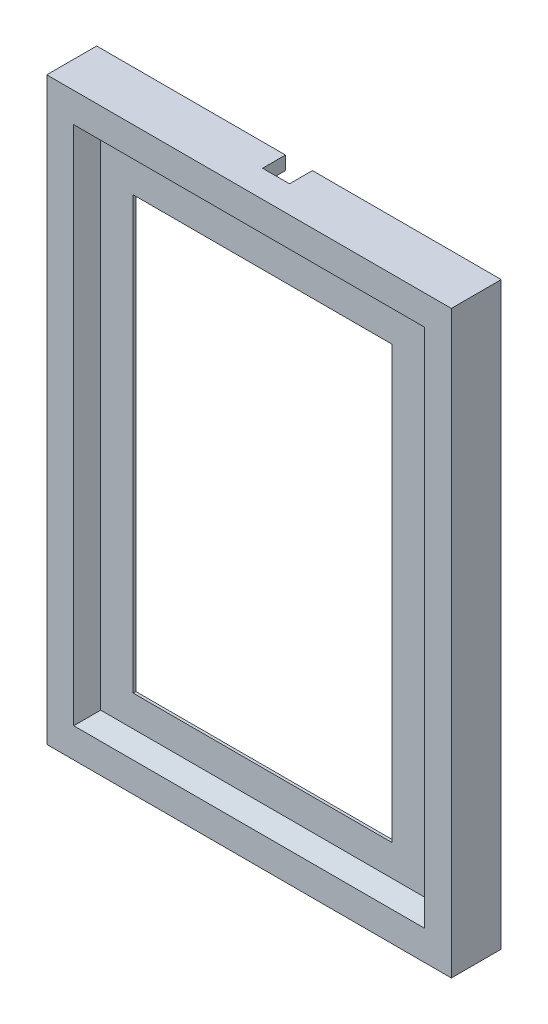
ISO-10303-21;
HEADER;
FILE_DESCRIPTION(('STEP AP214'),'2;1');
FILE_NAME('part.step','',(''),(''),'','','');
FILE_SCHEMA(('AUTOMOTIVE_DESIGN { 1 0 10303 214 1 1 1 1 }'));
ENDSEC;
DATA;
#1=APPLICATION_CONTEXT('core data for automotive mechanical design processes');
#2=APPLICATION_PROTOCOL_DEFINITION('international standard','automotive_design',2000,#1);
#3=PRODUCT_CONTEXT('',#1,'mechanical');
#4=PRODUCT('Part','Part','',(#3));
#5=PRODUCT_RELATED_PRODUCT_CATEGORY('part','',(#4));
#6=PRODUCT_DEFINITION_FORMATION('','',#4);
#7=PRODUCT_DEFINITION_CONTEXT('part definition',#1,'design');
#8=PRODUCT_DEFINITION('design','',#6,#7);
#9=PRODUCT_DEFINITION_SHAPE('','',#8);
#10=(LENGTH_UNIT() NAMED_UNIT(*) SI_UNIT(.MILLI.,.METRE.));
#11=(NAMED_UNIT(*) PLANE_ANGLE_UNIT() SI_UNIT($,.RADIAN.));
#12=(NAMED_UNIT(*) SI_UNIT($,.STERADIAN.) SOLID_ANGLE_UNIT());
#13=UNCERTAINTY_MEASURE_WITH_UNIT(LENGTH_MEASURE(1.E-05),#10,'distance_accuracy_value','');
#14=(GEOMETRIC_REPRESENTATION_CONTEXT(3) GLOBAL_UNCERTAINTY_ASSIGNED_CONTEXT((#13)) GLOBAL_UNIT_ASSIGNED_CONTEXT((#10,
#11,#12)) REPRESENTATION_CONTEXT('',''));
#15=CARTESIAN_POINT('',(0.,0.,0.));
#16=DIRECTION('',(0.,0.,1.));
#17=DIRECTION('',(1.,0.,0.));
#18=AXIS2_PLACEMENT_3D('',#15,#16,#17);
#19=CARTESIAN_POINT('',(0.,0.,4.));
#20=DIRECTION('',(0.,0.,-1.));
#21=DIRECTION('',(-1.,0.,0.));
#22=AXIS2_PLACEMENT_3D('',#19,#20,#21);
#23=PLANE('',#22);
#24=DIRECTION('',(0.,1.,0.));
#25=VECTOR('',#24,1.);
#26=CARTESIAN_POINT('',(-5.,0.,4.));
#27=LINE('',#26,#25);
#28=CARTESIAN_POINT('',(-5.,95.,4.));
#29=VERTEX_POINT('',#28);
#30=CARTESIAN_POINT('',(-5.,102.5,4.));
#31=VERTEX_POINT('',#30);
#32=EDGE_CURVE('E386',#29,#31,#27,.T.);
#33=ORIENTED_EDGE('',*,*,#32,.F.);
#34=DIRECTION('',(-1.,0.,0.));
#35=VECTOR('',#34,1.);
#36=CARTESIAN_POINT('',(65.,95.,4.));
#37=LINE('',#36,#35);
#38=CARTESIAN_POINT('',(-65.,95.,4.));
#39=VERTEX_POINT('',#38);
#40=EDGE_CURVE('E608',#29,#39,#37,.T.);
#41=ORIENTED_EDGE('',*,*,#40,.T.);
#42=DIRECTION('',(0.,1.,0.));
#43=VECTOR('',#42,1.);
#44=CARTESIAN_POINT('',(-65.,102.5,4.));
#45=LINE('',#44,#43);
#46=CARTESIAN_POINT('',(-65.,102.5,4.));
#47=VERTEX_POINT('',#46);
#48=EDGE_CURVE('E428',#39,#47,#45,.T.);
#49=ORIENTED_EDGE('',*,*,#48,.T.);
#50=DIRECTION('',(1.,0.,0.));
#51=VECTOR('',#50,1.);
#52=CARTESIAN_POINT('',(65.,102.5,4.));
#53=LINE('',#52,#51);
#54=EDGE_CURVE('E435',#47,#31,#53,.T.);
#55=ORIENTED_EDGE('',*,*,#54,.T.);
#56=EDGE_LOOP('',(#33,#41,#49,#55));
#57=FACE_BOUND('',#56,.T.);
#58=CARTESIAN_POINT('',(-61.,98.5,4.));
#59=DIRECTION('',(0.,0.,-1.));
#60=DIRECTION('',(-1.,0.,0.));
#61=AXIS2_PLACEMENT_3D('',#58,#59,#60);
#62=CIRCLE('',#61,2.5);
#63=CARTESIAN_POINT('',(-63.5,98.5,4.));
#64=VERTEX_POINT('',#63);
#65=EDGE_CURVE('E404',#64,#64,#62,.T.);
#66=ORIENTED_EDGE('',*,*,#65,.F.);
#67=EDGE_LOOP('',(#66));
#68=FACE_BOUND('',#67,.T.);
#69=ADVANCED_FACE('F41',(#57,#68),#23,.T.);
#70=CARTESIAN_POINT('',(65.,102.5,4.));
#71=DIRECTION('',(0.,1.,0.));
#72=DIRECTION('',(0.,0.,1.));
#73=AXIS2_PLACEMENT_3D('',#70,#71,#72);
#74=PLANE('',#73);
#75=DIRECTION('',(0.,0.,-1.));
#76=VECTOR('',#75,1.);
#77=CARTESIAN_POINT('',(-65.,102.5,4.));
#78=LINE('',#77,#76);
#79=CARTESIAN_POINT('',(-65.,102.5,-3.5));
#80=VERTEX_POINT('',#79);
#81=EDGE_CURVE('E447',#47,#80,#78,.T.);
#82=ORIENTED_EDGE('',*,*,#81,.T.);
#83=DIRECTION('',(-1.,0.,0.));
#84=VECTOR('',#83,1.);
#85=CARTESIAN_POINT('',(-5.,102.5,-3.5));
#86=LINE('',#85,#84);
#87=CARTESIAN_POINT('',(-5.,102.5,-3.5));
#88=VERTEX_POINT('',#87);
#89=EDGE_CURVE('E293',#88,#80,#86,.T.);
#90=ORIENTED_EDGE('',*,*,#89,.F.);
#91=DIRECTION('',(0.,0.,1.));
#92=VECTOR('',#91,1.);
#93=CARTESIAN_POINT('',(-5.,102.5,4.));
#94=LINE('',#93,#92);
#95=EDGE_CURVE('E382',#88,#31,#94,.T.);
#96=ORIENTED_EDGE('',*,*,#95,.T.);
#97=ORIENTED_EDGE('',*,*,#54,.F.);
#98=EDGE_LOOP('',(#82,#90,#96,#97));
#99=FACE_BOUND('',#98,.T.);
#100=ADVANCED_FACE('F671',(#99),#74,.F.);
#101=DIRECTION('',(0.,1.,0.));
#102=VECTOR('',#101,1.);
#103=CARTESIAN_POINT('',(-5.,0.,4.));
#104=LINE('',#103,#102);
#105=CARTESIAN_POINT('',(-5.,-102.5,4.));
#106=VERTEX_POINT('',#105);
#107=CARTESIAN_POINT('',(-5.,-95.,4.));
#108=VERTEX_POINT('',#107);
#109=EDGE_CURVE('E375',#106,#108,#104,.T.);
#110=ORIENTED_EDGE('',*,*,#109,.F.);
#111=DIRECTION('',(-1.,0.,0.));
#112=VECTOR('',#111,1.);
#113=CARTESIAN_POINT('',(65.,-102.5,4.));
#114=LINE('',#113,#112);
#115=CARTESIAN_POINT('',(-65.,-102.5,4.));
#116=VERTEX_POINT('',#115);
#117=EDGE_CURVE('E257',#106,#116,#114,.T.);
#118=ORIENTED_EDGE('',*,*,#117,.T.);
#119=CARTESIAN_POINT('',(-65.,-95.,4.));
#120=VERTEX_POINT('',#119);
#121=EDGE_CURVE('E66',#116,#120,#45,.T.);
#122=ORIENTED_EDGE('',*,*,#121,.T.);
#123=DIRECTION('',(1.,0.,0.));
#124=VECTOR('',#123,1.);
#125=CARTESIAN_POINT('',(65.,-95.,4.));
#126=LINE('',#125,#124);
#127=EDGE_CURVE('E460',#120,#108,#126,.T.);
#128=ORIENTED_EDGE('',*,*,#127,.T.);
#129=EDGE_LOOP('',(#110,#118,#122,#128));
#130=FACE_BOUND('',#129,.T.);
#131=CARTESIAN_POINT('',(-61.,-98.5,4.));
#132=DIRECTION('',(0.,0.,-1.));
#133=DIRECTION('',(-1.,0.,0.));
#134=AXIS2_PLACEMENT_3D('',#131,#132,#133);
#135=CIRCLE('',#134,2.5);
#136=CARTESIAN_POINT('',(-63.5,-98.5,4.));
#137=VERTEX_POINT('',#136);
#138=EDGE_CURVE('E399',#137,#137,#135,.T.);
#139=ORIENTED_EDGE('',*,*,#138,.F.);
#140=EDGE_LOOP('',(#139));
#141=FACE_BOUND('',#140,.T.);
#142=ADVANCED_FACE('F710',(#130,#141),#23,.T.);
#143=CARTESIAN_POINT('',(65.,-102.5,4.));
#144=DIRECTION('',(0.,-1.,0.));
#145=DIRECTION('',(0.,0.,-1.));
#146=AXIS2_PLACEMENT_3D('',#143,#144,#145);
#147=PLANE('',#146);
#148=ORIENTED_EDGE('',*,*,#117,.F.);
#149=DIRECTION('',(0.,0.,-1.));
#150=VECTOR('',#149,1.);
#151=CARTESIAN_POINT('',(-5.,-102.5,4.));
#152=LINE('',#151,#150);
#153=CARTESIAN_POINT('',(-5.,-102.5,-3.5));
#154=VERTEX_POINT('',#153);
#155=EDGE_CURVE('E11',#106,#154,#152,.T.);
#156=ORIENTED_EDGE('',*,*,#155,.T.);
#157=DIRECTION('',(1.,0.,0.));
#158=VECTOR('',#157,1.);
#159=CARTESIAN_POINT('',(-65.,-102.5,-3.5));
#160=LINE('',#159,#158);
#161=CARTESIAN_POINT('',(-65.,-102.5,-3.5));
#162=VERTEX_POINT('',#161);
#163=EDGE_CURVE('E256',#162,#154,#160,.T.);
#164=ORIENTED_EDGE('',*,*,#163,.F.);
#165=DIRECTION('',(0.,0.,-1.));
#166=VECTOR('',#165,1.);
#167=CARTESIAN_POINT('',(-65.,-102.5,4.));
#168=LINE('',#167,#166);
#169=EDGE_CURVE('E448',#116,#162,#168,.T.);
#170=ORIENTED_EDGE('',*,*,#169,.F.);
#171=EDGE_LOOP('',(#148,#156,#164,#170));
#172=FACE_BOUND('',#171,.T.);
#173=ADVANCED_FACE('F253',(#172),#147,.F.);
#174=CARTESIAN_POINT('',(65.,-95.,9.));
#175=DIRECTION('',(0.,-1.,0.));
#176=DIRECTION('',(0.,0.,-1.));
#177=AXIS2_PLACEMENT_3D('',#174,#175,#176);
#178=PLANE('',#177);
#179=DIRECTION('',(1.,0.,0.));
#180=VECTOR('',#179,1.);
#181=CARTESIAN_POINT('',(65.,-95.,5.));
#182=LINE('',#181,#180);
#183=CARTESIAN_POINT('',(-5.,-95.,5.));
#184=VERTEX_POINT('',#183);
#185=CARTESIAN_POINT('',(5.,-95.,5.));
#186=VERTEX_POINT('',#185);
#187=EDGE_CURVE('E396',#184,#186,#182,.T.);
#188=ORIENTED_EDGE('',*,*,#187,.F.);
#189=DIRECTION('',(0.,0.,-1.));
#190=VECTOR('',#189,1.);
#191=CARTESIAN_POINT('',(-5.,-95.,9.));
#192=LINE('',#191,#190);
#193=EDGE_CURVE('E378',#184,#108,#192,.T.);
#194=ORIENTED_EDGE('',*,*,#193,.T.);
#195=ORIENTED_EDGE('',*,*,#127,.F.);
#196=DIRECTION('',(0.,0.,-1.));
#197=VECTOR('',#196,1.);
#198=CARTESIAN_POINT('',(-65.,-95.,9.));
#199=LINE('',#198,#197);
#200=CARTESIAN_POINT('',(-65.,-95.,9.));
#201=VERTEX_POINT('',#200);
#202=EDGE_CURVE('E480',#201,#120,#199,.T.);
#203=ORIENTED_EDGE('',*,*,#202,.F.);
#204=DIRECTION('',(-1.,0.,0.));
#205=VECTOR('',#204,1.);
#206=CARTESIAN_POINT('',(65.,-95.,9.));
#207=LINE('',#206,#205);
#208=CARTESIAN_POINT('',(65.,-95.,9.));
#209=VERTEX_POINT('',#208);
#210=EDGE_CURVE('E475',#209,#201,#207,.T.);
#211=ORIENTED_EDGE('',*,*,#210,.F.);
#212=DIRECTION('',(0.,0.,-1.));
#213=VECTOR('',#212,1.);
#214=CARTESIAN_POINT('',(65.,-95.,9.));
#215=LINE('',#214,#213);
#216=CARTESIAN_POINT('',(65.,-95.,4.));
#217=VERTEX_POINT('',#216);
#218=EDGE_CURVE('E485',#209,#217,#215,.T.);
#219=ORIENTED_EDGE('',*,*,#218,.T.);
#220=CARTESIAN_POINT('',(5.,-95.,4.));
#221=VERTEX_POINT('',#220);
#222=EDGE_CURVE('E451',#221,#217,#126,.T.);
#223=ORIENTED_EDGE('',*,*,#222,.F.);
#224=DIRECTION('',(0.,0.,1.));
#225=VECTOR('',#224,1.);
#226=CARTESIAN_POINT('',(5.,-95.,9.));
#227=LINE('',#226,#225);
#228=EDGE_CURVE('E361',#221,#186,#227,.T.);
#229=ORIENTED_EDGE('',*,*,#228,.T.);
#230=EDGE_LOOP('',(#188,#194,#195,#203,#211,#219,#223,#229));
#231=FACE_BOUND('',#230,.T.);
#232=ADVANCED_FACE('F713',(#231),#178,.F.);
#233=CARTESIAN_POINT('',(65.,95.,9.));
#234=DIRECTION('',(0.,1.,0.));
#235=DIRECTION('',(0.,0.,1.));
#236=AXIS2_PLACEMENT_3D('',#233,#234,#235);
#237=PLANE('',#236);
#238=ORIENTED_EDGE('',*,*,#40,.F.);
#239=DIRECTION('',(0.,0.,1.));
#240=VECTOR('',#239,1.);
#241=CARTESIAN_POINT('',(-5.,95.,9.));
#242=LINE('',#241,#240);
#243=CARTESIAN_POINT('',(-5.,95.,5.));
#244=VERTEX_POINT('',#243);
#245=EDGE_CURVE('E389',#29,#244,#242,.T.);
#246=ORIENTED_EDGE('',*,*,#245,.T.);
#247=DIRECTION('',(-1.,0.,0.));
#248=VECTOR('',#247,1.);
#249=CARTESIAN_POINT('',(65.,95.,5.));
#250=LINE('',#249,#248);
#251=CARTESIAN_POINT('',(5.,95.,5.));
#252=VERTEX_POINT('',#251);
#253=EDGE_CURVE('E393',#252,#244,#250,.T.);
#254=ORIENTED_EDGE('',*,*,#253,.F.);
#255=DIRECTION('',(0.,0.,-1.));
#256=VECTOR('',#255,1.);
#257=CARTESIAN_POINT('',(5.,95.,9.));
#258=LINE('',#257,#256);
#259=CARTESIAN_POINT('',(5.,95.,4.));
#260=VERTEX_POINT('',#259);
#261=EDGE_CURVE('E371',#252,#260,#258,.T.);
#262=ORIENTED_EDGE('',*,*,#261,.T.);
#263=CARTESIAN_POINT('',(65.,95.,4.));
#264=VERTEX_POINT('',#263);
#265=EDGE_CURVE('E609',#264,#260,#37,.T.);
#266=ORIENTED_EDGE('',*,*,#265,.F.);
#267=DIRECTION('',(0.,0.,-1.));
#268=VECTOR('',#267,1.);
#269=CARTESIAN_POINT('',(65.,95.,9.));
#270=LINE('',#269,#268);
#271=CARTESIAN_POINT('',(65.,95.,9.));
#272=VERTEX_POINT('',#271);
#273=EDGE_CURVE('E489',#272,#264,#270,.T.);
#274=ORIENTED_EDGE('',*,*,#273,.F.);
#275=DIRECTION('',(1.,0.,0.));
#276=VECTOR('',#275,1.);
#277=CARTESIAN_POINT('',(65.,95.,9.));
#278=LINE('',#277,#276);
#279=CARTESIAN_POINT('',(-65.,95.,9.));
#280=VERTEX_POINT('',#279);
#281=EDGE_CURVE('E467',#280,#272,#278,.T.);
#282=ORIENTED_EDGE('',*,*,#281,.F.);
#283=DIRECTION('',(0.,0.,-1.));
#284=VECTOR('',#283,1.);
#285=CARTESIAN_POINT('',(-65.,95.,9.));
#286=LINE('',#285,#284);
#287=EDGE_CURVE('E479',#280,#39,#286,.T.);
#288=ORIENTED_EDGE('',*,*,#287,.T.);
#289=EDGE_LOOP('',(#238,#246,#254,#262,#266,#274,#282,#288));
#290=FACE_BOUND('',#289,.T.);
#291=ADVANCED_FACE('F662',(#290),#237,.F.);
#292=CARTESIAN_POINT('',(48.,80.,15.));
#293=DIRECTION('',(-1.,0.,0.));
#294=DIRECTION('',(0.,-1.,0.));
#295=AXIS2_PLACEMENT_3D('',#292,#293,#294);
#296=PLANE('',#295);
#297=DIRECTION('',(0.,0.,-1.));
#298=VECTOR('',#297,1.);
#299=CARTESIAN_POINT('',(48.,80.,15.));
#300=LINE('',#299,#298);
#301=CARTESIAN_POINT('',(48.,80.,10.));
#302=VERTEX_POINT('',#301);
#303=CARTESIAN_POINT('',(48.,80.,9.));
#304=VERTEX_POINT('',#303);
#305=EDGE_CURVE('E546',#302,#304,#300,.T.);
#306=ORIENTED_EDGE('',*,*,#305,.T.);
#307=DIRECTION('',(0.,-1.,0.));
#308=VECTOR('',#307,1.);
#309=CARTESIAN_POINT('',(48.,80.,9.));
#310=LINE('',#309,#308);
#311=CARTESIAN_POINT('',(48.,-80.,9.));
#312=VERTEX_POINT('',#311);
#313=EDGE_CURVE('E503',#304,#312,#310,.T.);
#314=ORIENTED_EDGE('',*,*,#313,.T.);
#315=DIRECTION('',(0.,0.,-1.));
#316=VECTOR('',#315,1.);
#317=CARTESIAN_POINT('',(48.,-80.,15.));
#318=LINE('',#317,#316);
#319=CARTESIAN_POINT('',(48.,-80.,10.));
#320=VERTEX_POINT('',#319);
#321=EDGE_CURVE('E534',#320,#312,#318,.T.);
#322=ORIENTED_EDGE('',*,*,#321,.F.);
#323=DIRECTION('',(0.,1.,0.));
#324=VECTOR('',#323,1.);
#325=CARTESIAN_POINT('',(48.,80.,10.));
#326=LINE('',#325,#324);
#327=EDGE_CURVE('E530',#320,#302,#326,.T.);
#328=ORIENTED_EDGE('',*,*,#327,.T.);
#329=EDGE_LOOP('',(#306,#314,#322,#328));
#330=FACE_BOUND('',#329,.T.);
#331=ADVANCED_FACE('F720',(#330),#296,.T.);
#332=CARTESIAN_POINT('',(-48.,80.,15.));
#333=DIRECTION('',(0.,-1.,0.));
#334=DIRECTION('',(0.,0.,-1.));
#335=AXIS2_PLACEMENT_3D('',#332,#333,#334);
#336=PLANE('',#335);
#337=DIRECTION('',(0.,0.,-1.));
#338=VECTOR('',#337,1.);
#339=CARTESIAN_POINT('',(-48.,80.,15.));
#340=LINE('',#339,#338);
#341=CARTESIAN_POINT('',(-48.,80.,10.));
#342=VERTEX_POINT('',#341);
#343=CARTESIAN_POINT('',(-48.,80.,9.));
#344=VERTEX_POINT('',#343);
#345=EDGE_CURVE('E542',#342,#344,#340,.T.);
#346=ORIENTED_EDGE('',*,*,#345,.T.);
#347=DIRECTION('',(1.,0.,0.));
#348=VECTOR('',#347,1.);
#349=CARTESIAN_POINT('',(-48.,80.,9.));
#350=LINE('',#349,#348);
#351=EDGE_CURVE('E499',#344,#304,#350,.T.);
#352=ORIENTED_EDGE('',*,*,#351,.T.);
#353=ORIENTED_EDGE('',*,*,#305,.F.);
#354=DIRECTION('',(-1.,0.,0.));
#355=VECTOR('',#354,1.);
#356=CARTESIAN_POINT('',(-48.,80.,10.));
#357=LINE('',#356,#355);
#358=EDGE_CURVE('E526',#302,#342,#357,.T.);
#359=ORIENTED_EDGE('',*,*,#358,.T.);
#360=EDGE_LOOP('',(#346,#352,#353,#359));
#361=FACE_BOUND('',#360,.T.);
#362=ADVANCED_FACE('F755',(#361),#336,.T.);
#363=CARTESIAN_POINT('',(-48.,80.,15.));
#364=DIRECTION('',(1.,0.,0.));
#365=DIRECTION('',(0.,1.,0.));
#366=AXIS2_PLACEMENT_3D('',#363,#364,#365);
#367=PLANE('',#366);
#368=DIRECTION('',(0.,0.,-1.));
#369=VECTOR('',#368,1.);
#370=CARTESIAN_POINT('',(-48.,-80.,15.));
#371=LINE('',#370,#369);
#372=CARTESIAN_POINT('',(-48.,-80.,10.));
#373=VERTEX_POINT('',#372);
#374=CARTESIAN_POINT('',(-48.,-80.,9.));
#375=VERTEX_POINT('',#374);
#376=EDGE_CURVE('E538',#373,#375,#371,.T.);
#377=ORIENTED_EDGE('',*,*,#376,.T.);
#378=DIRECTION('',(0.,1.,0.));
#379=VECTOR('',#378,1.);
#380=CARTESIAN_POINT('',(-48.,80.,9.));
#381=LINE('',#380,#379);
#382=EDGE_CURVE('E484',#375,#344,#381,.T.);
#383=ORIENTED_EDGE('',*,*,#382,.T.);
#384=ORIENTED_EDGE('',*,*,#345,.F.);
#385=DIRECTION('',(0.,-1.,0.));
#386=VECTOR('',#385,1.);
#387=CARTESIAN_POINT('',(-48.,80.,10.));
#388=LINE('',#387,#386);
#389=EDGE_CURVE('E522',#342,#373,#388,.T.);
#390=ORIENTED_EDGE('',*,*,#389,.T.);
#391=EDGE_LOOP('',(#377,#383,#384,#390));
#392=FACE_BOUND('',#391,.T.);
#393=ADVANCED_FACE('F753',(#392),#367,.T.);
#394=CARTESIAN_POINT('',(-48.,-80.,15.));
#395=DIRECTION('',(0.,1.,0.));
#396=DIRECTION('',(0.,0.,1.));
#397=AXIS2_PLACEMENT_3D('',#394,#395,#396);
#398=PLANE('',#397);
#399=ORIENTED_EDGE('',*,*,#321,.T.);
#400=DIRECTION('',(-1.,0.,0.));
#401=VECTOR('',#400,1.);
#402=CARTESIAN_POINT('',(-48.,-80.,9.));
#403=LINE('',#402,#401);
#404=EDGE_CURVE('E592',#312,#375,#403,.T.);
#405=ORIENTED_EDGE('',*,*,#404,.T.);
#406=ORIENTED_EDGE('',*,*,#376,.F.);
#407=DIRECTION('',(1.,0.,0.));
#408=VECTOR('',#407,1.);
#409=CARTESIAN_POINT('',(-48.,-80.,10.));
#410=LINE('',#409,#408);
#411=EDGE_CURVE('E575',#373,#320,#410,.T.);
#412=ORIENTED_EDGE('',*,*,#411,.T.);
#413=EDGE_LOOP('',(#399,#405,#406,#412));
#414=FACE_BOUND('',#413,.T.);
#415=ADVANCED_FACE('F762',(#414),#398,.T.);
#416=CARTESIAN_POINT('',(0.,0.,15.));
#417=DIRECTION('',(0.,0.,1.));
#418=DIRECTION('',(1.,0.,0.));
#419=AXIS2_PLACEMENT_3D('',#416,#417,#418);
#420=PLANE('',#419);
#421=DIRECTION('',(0.,-1.,0.));
#422=VECTOR('',#421,1.);
#423=CARTESIAN_POINT('',(65.,-91.5,15.));
#424=LINE('',#423,#422);
#425=CARTESIAN_POINT('',(65.,96.5,15.));
#426=VERTEX_POINT('',#425);
#427=CARTESIAN_POINT('',(65.,-96.5,15.));
#428=VERTEX_POINT('',#427);
#429=EDGE_CURVE('E585',#426,#428,#424,.T.);
#430=ORIENTED_EDGE('',*,*,#429,.T.);
#431=DIRECTION('',(-1.,0.,0.));
#432=VECTOR('',#431,1.);
#433=CARTESIAN_POINT('',(-60.,-96.5,15.));
#434=LINE('',#433,#432);
#435=CARTESIAN_POINT('',(-65.,-96.5,15.));
#436=VERTEX_POINT('',#435);
#437=EDGE_CURVE('E588',#428,#436,#434,.T.);
#438=ORIENTED_EDGE('',*,*,#437,.T.);
#439=DIRECTION('',(0.,1.,0.));
#440=VECTOR('',#439,1.);
#441=CARTESIAN_POINT('',(-65.,91.5,15.));
#442=LINE('',#441,#440);
#443=CARTESIAN_POINT('',(-65.,96.5,15.));
#444=VERTEX_POINT('',#443);
#445=EDGE_CURVE('E582',#436,#444,#442,.T.);
#446=ORIENTED_EDGE('',*,*,#445,.T.);
#447=DIRECTION('',(1.,0.,0.));
#448=VECTOR('',#447,1.);
#449=CARTESIAN_POINT('',(60.,96.5,15.));
#450=LINE('',#449,#448);
#451=EDGE_CURVE('E579',#444,#426,#450,.T.);
#452=ORIENTED_EDGE('',*,*,#451,.T.);
#453=EDGE_LOOP('',(#430,#438,#446,#452));
#454=FACE_BOUND('',#453,.T.);
#455=DIRECTION('',(0.,1.,0.));
#456=VECTOR('',#455,1.);
#457=CARTESIAN_POINT('',(75.,107.5,15.));
#458=LINE('',#457,#456);
#459=CARTESIAN_POINT('',(75.,-107.5,15.));
#460=VERTEX_POINT('',#459);
#461=CARTESIAN_POINT('',(75.,107.5,15.));
#462=VERTEX_POINT('',#461);
#463=EDGE_CURVE('E550',#460,#462,#458,.T.);
#464=ORIENTED_EDGE('',*,*,#463,.T.);
#465=DIRECTION('',(-1.,0.,0.));
#466=VECTOR('',#465,1.);
#467=CARTESIAN_POINT('',(-75.,107.5,15.));
#468=LINE('',#467,#466);
#469=CARTESIAN_POINT('',(-75.,107.5,15.));
#470=VERTEX_POINT('',#469);
#471=EDGE_CURVE('E554',#462,#470,#468,.T.);
#472=ORIENTED_EDGE('',*,*,#471,.T.);
#473=DIRECTION('',(0.,-1.,0.));
#474=VECTOR('',#473,1.);
#475=CARTESIAN_POINT('',(-75.,107.5,15.));
#476=LINE('',#475,#474);
#477=CARTESIAN_POINT('',(-75.,-107.5,15.));
#478=VERTEX_POINT('',#477);
#479=EDGE_CURVE('E557',#470,#478,#476,.T.);
#480=ORIENTED_EDGE('',*,*,#479,.T.);
#481=DIRECTION('',(1.,0.,0.));
#482=VECTOR('',#481,1.);
#483=CARTESIAN_POINT('',(-75.,-107.5,15.));
#484=LINE('',#483,#482);
#485=EDGE_CURVE('E560',#478,#460,#484,.T.);
#486=ORIENTED_EDGE('',*,*,#485,.T.);
#487=EDGE_LOOP('',(#464,#472,#480,#486));
#488=FACE_BOUND('',#487,.T.);
#489=ADVANCED_FACE('F681',(#454,#488),#420,.T.);
#490=CARTESIAN_POINT('',(75.,107.5,15.));
#491=DIRECTION('',(-1.,0.,0.));
#492=DIRECTION('',(0.,-1.,0.));
#493=AXIS2_PLACEMENT_3D('',#490,#491,#492);
#494=PLANE('',#493);
#495=DIRECTION('',(0.,0.,-1.));
#496=VECTOR('',#495,1.);
#497=CARTESIAN_POINT('',(75.,-107.5,15.));
#498=LINE('',#497,#496);
#499=CARTESIAN_POINT('',(75.,-107.5,-3.5));
#500=VERTEX_POINT('',#499);
#501=EDGE_CURVE('E563',#460,#500,#498,.T.);
#502=ORIENTED_EDGE('',*,*,#501,.T.);
#503=DIRECTION('',(0.,-1.,0.));
#504=VECTOR('',#503,1.);
#505=CARTESIAN_POINT('',(75.,107.5,-3.5));
#506=LINE('',#505,#504);
#507=CARTESIAN_POINT('',(75.,107.5,-3.5));
#508=VERTEX_POINT('',#507);
#509=EDGE_CURVE('E306',#508,#500,#506,.T.);
#510=ORIENTED_EDGE('',*,*,#509,.F.);
#511=DIRECTION('',(0.,0.,-1.));
#512=VECTOR('',#511,1.);
#513=CARTESIAN_POINT('',(75.,107.5,15.));
#514=LINE('',#513,#512);
#515=EDGE_CURVE('E572',#462,#508,#514,.T.);
#516=ORIENTED_EDGE('',*,*,#515,.F.);
#517=ORIENTED_EDGE('',*,*,#463,.F.);
#518=EDGE_LOOP('',(#502,#510,#516,#517));
#519=FACE_BOUND('',#518,.T.);
#520=ADVANCED_FACE('F687',(#519),#494,.F.);
#521=CARTESIAN_POINT('',(-75.,107.5,15.));
#522=DIRECTION('',(0.,-1.,0.));
#523=DIRECTION('',(0.,0.,-1.));
#524=AXIS2_PLACEMENT_3D('',#521,#522,#523);
#525=PLANE('',#524);
#526=DIRECTION('',(1.,0.,0.));
#527=VECTOR('',#526,1.);
#528=CARTESIAN_POINT('',(5.,107.5,5.));
#529=LINE('',#528,#527);
#530=CARTESIAN_POINT('',(-5.,107.5,5.));
#531=VERTEX_POINT('',#530);
#532=CARTESIAN_POINT('',(5.,107.5,5.));
#533=VERTEX_POINT('',#532);
#534=EDGE_CURVE('E335',#531,#533,#529,.T.);
#535=ORIENTED_EDGE('',*,*,#534,.F.);
#536=DIRECTION('',(0.,0.,-1.));
#537=VECTOR('',#536,1.);
#538=CARTESIAN_POINT('',(-5.,107.5,5.));
#539=LINE('',#538,#537);
#540=CARTESIAN_POINT('',(-5.,107.5,-3.5));
#541=VERTEX_POINT('',#540);
#542=EDGE_CURVE('E348',#531,#541,#539,.T.);
#543=ORIENTED_EDGE('',*,*,#542,.T.);
#544=DIRECTION('',(1.,0.,0.));
#545=VECTOR('',#544,1.);
#546=CARTESIAN_POINT('',(-75.,107.5,-3.5));
#547=LINE('',#546,#545);
#548=CARTESIAN_POINT('',(-75.,107.5,-3.5));
#549=VERTEX_POINT('',#548);
#550=EDGE_CURVE('E285',#549,#541,#547,.T.);
#551=ORIENTED_EDGE('',*,*,#550,.F.);
#552=DIRECTION('',(0.,0.,-1.));
#553=VECTOR('',#552,1.);
#554=CARTESIAN_POINT('',(-75.,107.5,15.));
#555=LINE('',#554,#553);
#556=EDGE_CURVE('E569',#470,#549,#555,.T.);
#557=ORIENTED_EDGE('',*,*,#556,.F.);
#558=ORIENTED_EDGE('',*,*,#471,.F.);
#559=ORIENTED_EDGE('',*,*,#515,.T.);
#560=DIRECTION('',(1.,0.,0.));
#561=VECTOR('',#560,1.);
#562=CARTESIAN_POINT('',(5.,107.5,-3.5));
#563=LINE('',#562,#561);
#564=CARTESIAN_POINT('',(5.,107.5,-3.5));
#565=VERTEX_POINT('',#564);
#566=EDGE_CURVE('E302',#565,#508,#563,.T.);
#567=ORIENTED_EDGE('',*,*,#566,.F.);
#568=DIRECTION('',(0.,0.,-1.));
#569=VECTOR('',#568,1.);
#570=CARTESIAN_POINT('',(5.,107.5,5.));
#571=LINE('',#570,#569);
#572=EDGE_CURVE('E354',#533,#565,#571,.T.);
#573=ORIENTED_EDGE('',*,*,#572,.F.);
#574=EDGE_LOOP('',(#535,#543,#551,#557,#558,#559,#567,#573));
#575=FACE_BOUND('',#574,.T.);
#576=ADVANCED_FACE('F655',(#575),#525,.F.);
#577=CARTESIAN_POINT('',(-75.,107.5,15.));
#578=DIRECTION('',(1.,0.,0.));
#579=DIRECTION('',(0.,1.,0.));
#580=AXIS2_PLACEMENT_3D('',#577,#578,#579);
#581=PLANE('',#580);
#582=ORIENTED_EDGE('',*,*,#556,.T.);
#583=DIRECTION('',(0.,1.,0.));
#584=VECTOR('',#583,1.);
#585=CARTESIAN_POINT('',(-75.,-107.5,-3.5));
#586=LINE('',#585,#584);
#587=CARTESIAN_POINT('',(-75.,-107.5,-3.5));
#588=VERTEX_POINT('',#587);
#589=EDGE_CURVE('E281',#588,#549,#586,.T.);
#590=ORIENTED_EDGE('',*,*,#589,.F.);
#591=DIRECTION('',(0.,0.,-1.));
#592=VECTOR('',#591,1.);
#593=CARTESIAN_POINT('',(-75.,-107.5,15.));
#594=LINE('',#593,#592);
#595=EDGE_CURVE('E566',#478,#588,#594,.T.);
#596=ORIENTED_EDGE('',*,*,#595,.F.);
#597=ORIENTED_EDGE('',*,*,#479,.F.);
#598=EDGE_LOOP('',(#582,#590,#596,#597));
#599=FACE_BOUND('',#598,.T.);
#600=ADVANCED_FACE('F678',(#599),#581,.F.);
#601=CARTESIAN_POINT('',(-75.,-107.5,15.));
#602=DIRECTION('',(0.,1.,0.));
#603=DIRECTION('',(0.,0.,1.));
#604=AXIS2_PLACEMENT_3D('',#601,#602,#603);
#605=PLANE('',#604);
#606=ORIENTED_EDGE('',*,*,#595,.T.);
#607=DIRECTION('',(-1.,0.,0.));
#608=VECTOR('',#607,1.);
#609=CARTESIAN_POINT('',(-5.,-107.5,-3.5));
#610=LINE('',#609,#608);
#611=CARTESIAN_POINT('',(-5.,-107.5,-3.5));
#612=VERTEX_POINT('',#611);
#613=EDGE_CURVE('E269',#612,#588,#610,.T.);
#614=ORIENTED_EDGE('',*,*,#613,.F.);
#615=DIRECTION('',(0.,0.,-1.));
#616=VECTOR('',#615,1.);
#617=CARTESIAN_POINT('',(-5.,-107.5,5.));
#618=LINE('',#617,#616);
#619=CARTESIAN_POINT('',(-5.,-107.5,5.));
#620=VERTEX_POINT('',#619);
#621=EDGE_CURVE('E264',#620,#612,#618,.T.);
#622=ORIENTED_EDGE('',*,*,#621,.F.);
#623=DIRECTION('',(-1.,0.,0.));
#624=VECTOR('',#623,1.);
#625=CARTESIAN_POINT('',(5.,-107.5,5.));
#626=LINE('',#625,#624);
#627=CARTESIAN_POINT('',(5.,-107.5,5.));
#628=VERTEX_POINT('',#627);
#629=EDGE_CURVE('E344',#628,#620,#626,.T.);
#630=ORIENTED_EDGE('',*,*,#629,.F.);
#631=DIRECTION('',(0.,0.,-1.));
#632=VECTOR('',#631,1.);
#633=CARTESIAN_POINT('',(5.,-107.5,5.));
#634=LINE('',#633,#632);
#635=CARTESIAN_POINT('',(5.,-107.5,-3.5));
#636=VERTEX_POINT('',#635);
#637=EDGE_CURVE('E351',#628,#636,#634,.T.);
#638=ORIENTED_EDGE('',*,*,#637,.T.);
#639=DIRECTION('',(-1.,0.,0.));
#640=VECTOR('',#639,1.);
#641=CARTESIAN_POINT('',(75.,-107.5,-3.5));
#642=LINE('',#641,#640);
#643=EDGE_CURVE('E310',#500,#636,#642,.T.);
#644=ORIENTED_EDGE('',*,*,#643,.F.);
#645=ORIENTED_EDGE('',*,*,#501,.F.);
#646=ORIENTED_EDGE('',*,*,#485,.F.);
#647=EDGE_LOOP('',(#606,#614,#622,#630,#638,#644,#645,#646));
#648=FACE_BOUND('',#647,.T.);
#649=ADVANCED_FACE('F637',(#648),#605,.F.);
#650=CARTESIAN_POINT('',(0.,0.,10.));
#651=DIRECTION('',(0.,0.,1.));
#652=DIRECTION('',(1.,0.,0.));
#653=AXIS2_PLACEMENT_3D('',#650,#651,#652);
#654=PLANE('',#653);
#655=ORIENTED_EDGE('',*,*,#411,.F.);
#656=ORIENTED_EDGE('',*,*,#389,.F.);
#657=ORIENTED_EDGE('',*,*,#358,.F.);
#658=ORIENTED_EDGE('',*,*,#327,.F.);
#659=EDGE_LOOP('',(#655,#656,#657,#658));
#660=FACE_BOUND('',#659,.T.);
#661=DIRECTION('',(0.,1.,0.));
#662=VECTOR('',#661,1.);
#663=CARTESIAN_POINT('',(60.,91.5,10.));
#664=LINE('',#663,#662);
#665=CARTESIAN_POINT('',(60.,-91.5,10.));
#666=VERTEX_POINT('',#665);
#667=CARTESIAN_POINT('',(60.,91.5,10.));
#668=VERTEX_POINT('',#667);
#669=EDGE_CURVE('E508',#666,#668,#664,.T.);
#670=ORIENTED_EDGE('',*,*,#669,.T.);
#671=DIRECTION('',(-1.,0.,0.));
#672=VECTOR('',#671,1.);
#673=CARTESIAN_POINT('',(-60.,91.5,10.));
#674=LINE('',#673,#672);
#675=CARTESIAN_POINT('',(-60.,91.5,10.));
#676=VERTEX_POINT('',#675);
#677=EDGE_CURVE('E511',#668,#676,#674,.T.);
#678=ORIENTED_EDGE('',*,*,#677,.T.);
#679=DIRECTION('',(0.,-1.,0.));
#680=VECTOR('',#679,1.);
#681=CARTESIAN_POINT('',(-60.,91.5,10.));
#682=LINE('',#681,#680);
#683=CARTESIAN_POINT('',(-60.,-91.5,10.));
#684=VERTEX_POINT('',#683);
#685=EDGE_CURVE('E515',#676,#684,#682,.T.);
#686=ORIENTED_EDGE('',*,*,#685,.T.);
#687=DIRECTION('',(1.,0.,0.));
#688=VECTOR('',#687,1.);
#689=CARTESIAN_POINT('',(-60.,-91.5,10.));
#690=LINE('',#689,#688);
#691=EDGE_CURVE('E518',#684,#666,#690,.T.);
#692=ORIENTED_EDGE('',*,*,#691,.T.);
#693=EDGE_LOOP('',(#670,#678,#686,#692));
#694=FACE_BOUND('',#693,.T.);
#695=ADVANCED_FACE('F757',(#660,#694),#654,.T.);
#696=CARTESIAN_POINT('',(-60.,91.5,10.));
#697=DIRECTION('',(0.,-0.707106781186547,0.707106781186548));
#698=DIRECTION('',(1.,0.,0.));
#699=AXIS2_PLACEMENT_3D('',#696,#697,#698);
#700=PLANE('',#699);
#701=DIRECTION('',(0.577350269189626,0.577350269189626,0.577350269189626));
#702=VECTOR('',#701,1.);
#703=CARTESIAN_POINT('',(60.,91.5,10.));
#704=LINE('',#703,#702);
#705=EDGE_CURVE('E598',#426,#668,#704,.F.);
#706=ORIENTED_EDGE('',*,*,#705,.F.);
#707=ORIENTED_EDGE('',*,*,#451,.F.);
#708=DIRECTION('',(0.577350269189626,-0.577350269189626,-0.577350269189626));
#709=VECTOR('',#708,1.);
#710=CARTESIAN_POINT('',(-60.,91.5,10.));
#711=LINE('',#710,#709);
#712=EDGE_CURVE('E512',#676,#444,#711,.F.);
#713=ORIENTED_EDGE('',*,*,#712,.F.);
#714=ORIENTED_EDGE('',*,*,#677,.F.);
#715=EDGE_LOOP('',(#706,#707,#713,#714));
#716=FACE_BOUND('',#715,.T.);
#717=ADVANCED_FACE('F44',(#716),#700,.T.);
#718=CARTESIAN_POINT('',(-60.,91.5,10.));
#719=DIRECTION('',(0.707106781186547,0.,0.707106781186548));
#720=DIRECTION('',(0.,1.,0.));
#721=AXIS2_PLACEMENT_3D('',#718,#719,#720);
#722=PLANE('',#721);
#723=ORIENTED_EDGE('',*,*,#712,.T.);
#724=ORIENTED_EDGE('',*,*,#445,.F.);
#725=DIRECTION('',(0.577350269189626,0.577350269189626,-0.577350269189626));
#726=VECTOR('',#725,1.);
#727=CARTESIAN_POINT('',(-60.,-91.5,10.));
#728=LINE('',#727,#726);
#729=EDGE_CURVE('E595',#684,#436,#728,.F.);
#730=ORIENTED_EDGE('',*,*,#729,.F.);
#731=ORIENTED_EDGE('',*,*,#685,.F.);
#732=EDGE_LOOP('',(#723,#724,#730,#731));
#733=FACE_BOUND('',#732,.T.);
#734=ADVANCED_FACE('F799',(#733),#722,.T.);
#735=CARTESIAN_POINT('',(60.,91.5,10.));
#736=DIRECTION('',(-0.707106781186547,0.,0.707106781186548));
#737=DIRECTION('',(0.,-1.,0.));
#738=AXIS2_PLACEMENT_3D('',#735,#736,#737);
#739=PLANE('',#738);
#740=ORIENTED_EDGE('',*,*,#705,.T.);
#741=ORIENTED_EDGE('',*,*,#669,.F.);
#742=DIRECTION('',(0.577350269189626,-0.577350269189626,0.577350269189626));
#743=VECTOR('',#742,1.);
#744=CARTESIAN_POINT('',(20.,-51.5,-30.));
#745=LINE('',#744,#743);
#746=EDGE_CURVE('E507',#428,#666,#745,.F.);
#747=ORIENTED_EDGE('',*,*,#746,.F.);
#748=ORIENTED_EDGE('',*,*,#429,.F.);
#749=EDGE_LOOP('',(#740,#741,#747,#748));
#750=FACE_BOUND('',#749,.T.);
#751=ADVANCED_FACE('F793',(#750),#739,.T.);
#752=CARTESIAN_POINT('',(-60.,-91.5,10.));
#753=DIRECTION('',(0.,0.707106781186547,0.707106781186548));
#754=DIRECTION('',(-1.,0.,0.));
#755=AXIS2_PLACEMENT_3D('',#752,#753,#754);
#756=PLANE('',#755);
#757=ORIENTED_EDGE('',*,*,#729,.T.);
#758=ORIENTED_EDGE('',*,*,#437,.F.);
#759=ORIENTED_EDGE('',*,*,#746,.T.);
#760=ORIENTED_EDGE('',*,*,#691,.F.);
#761=EDGE_LOOP('',(#757,#758,#759,#760));
#762=FACE_BOUND('',#761,.T.);
#763=ADVANCED_FACE('F788',(#762),#756,.T.);
#764=CARTESIAN_POINT('',(-65.,95.,9.));
#765=DIRECTION('',(-1.,0.,0.));
#766=DIRECTION('',(0.,-1.,0.));
#767=AXIS2_PLACEMENT_3D('',#764,#765,#766);
#768=PLANE('',#767);
#769=ORIENTED_EDGE('',*,*,#169,.T.);
#770=DIRECTION('',(0.,-1.,0.));
#771=VECTOR('',#770,1.);
#772=CARTESIAN_POINT('',(-65.,102.5,-3.5));
#773=LINE('',#772,#771);
#774=EDGE_CURVE('E275',#80,#162,#773,.T.);
#775=ORIENTED_EDGE('',*,*,#774,.F.);
#776=ORIENTED_EDGE('',*,*,#81,.F.);
#777=ORIENTED_EDGE('',*,*,#48,.F.);
#778=ORIENTED_EDGE('',*,*,#287,.F.);
#779=DIRECTION('',(0.,1.,0.));
#780=VECTOR('',#779,1.);
#781=CARTESIAN_POINT('',(-65.,95.,9.));
#782=LINE('',#781,#780);
#783=EDGE_CURVE('E463',#201,#280,#782,.T.);
#784=ORIENTED_EDGE('',*,*,#783,.F.);
#785=ORIENTED_EDGE('',*,*,#202,.T.);
#786=ORIENTED_EDGE('',*,*,#121,.F.);
#787=EDGE_LOOP('',(#769,#775,#776,#777,#778,#784,#785,#786));
#788=FACE_BOUND('',#787,.T.);
#789=ADVANCED_FACE('F704',(#788),#768,.F.);
#790=CARTESIAN_POINT('',(65.,95.,9.));
#791=DIRECTION('',(1.,0.,0.));
#792=DIRECTION('',(0.,1.,0.));
#793=AXIS2_PLACEMENT_3D('',#790,#791,#792);
#794=PLANE('',#793);
#795=DIRECTION('',(0.,0.,-1.));
#796=VECTOR('',#795,1.);
#797=CARTESIAN_POINT('',(65.,102.5,4.));
#798=LINE('',#797,#796);
#799=CARTESIAN_POINT('',(65.,102.5,4.));
#800=VERTEX_POINT('',#799);
#801=CARTESIAN_POINT('',(65.,102.5,-3.5));
#802=VERTEX_POINT('',#801);
#803=EDGE_CURVE('E455',#800,#802,#798,.T.);
#804=ORIENTED_EDGE('',*,*,#803,.T.);
#805=DIRECTION('',(0.,1.,0.));
#806=VECTOR('',#805,1.);
#807=CARTESIAN_POINT('',(65.,-102.5,-3.5));
#808=LINE('',#807,#806);
#809=CARTESIAN_POINT('',(65.,-102.5,-3.5));
#810=VERTEX_POINT('',#809);
#811=EDGE_CURVE('E322',#810,#802,#808,.T.);
#812=ORIENTED_EDGE('',*,*,#811,.F.);
#813=DIRECTION('',(0.,0.,-1.));
#814=VECTOR('',#813,1.);
#815=CARTESIAN_POINT('',(65.,-102.5,4.));
#816=LINE('',#815,#814);
#817=CARTESIAN_POINT('',(65.,-102.5,4.));
#818=VERTEX_POINT('',#817);
#819=EDGE_CURVE('E452',#818,#810,#816,.T.);
#820=ORIENTED_EDGE('',*,*,#819,.F.);
#821=DIRECTION('',(0.,-1.,0.));
#822=VECTOR('',#821,1.);
#823=CARTESIAN_POINT('',(65.,102.5,4.));
#824=LINE('',#823,#822);
#825=EDGE_CURVE('E439',#217,#818,#824,.T.);
#826=ORIENTED_EDGE('',*,*,#825,.F.);
#827=ORIENTED_EDGE('',*,*,#218,.F.);
#828=DIRECTION('',(0.,-1.,0.));
#829=VECTOR('',#828,1.);
#830=CARTESIAN_POINT('',(65.,95.,9.));
#831=LINE('',#830,#829);
#832=EDGE_CURVE('E471',#272,#209,#831,.T.);
#833=ORIENTED_EDGE('',*,*,#832,.F.);
#834=ORIENTED_EDGE('',*,*,#273,.T.);
#835=EDGE_CURVE('E440',#800,#264,#824,.T.);
#836=ORIENTED_EDGE('',*,*,#835,.F.);
#837=EDGE_LOOP('',(#804,#812,#820,#826,#827,#833,#834,#836));
#838=FACE_BOUND('',#837,.T.);
#839=ADVANCED_FACE('F627',(#838),#794,.F.);
#840=CARTESIAN_POINT('',(0.,0.,9.));
#841=DIRECTION('',(0.,0.,-1.));
#842=DIRECTION('',(-1.,0.,0.));
#843=AXIS2_PLACEMENT_3D('',#840,#841,#842);
#844=PLANE('',#843);
#845=ORIENTED_EDGE('',*,*,#351,.F.);
#846=ORIENTED_EDGE('',*,*,#382,.F.);
#847=ORIENTED_EDGE('',*,*,#404,.F.);
#848=ORIENTED_EDGE('',*,*,#313,.F.);
#849=EDGE_LOOP('',(#845,#846,#847,#848));
#850=FACE_BOUND('',#849,.T.);
#851=ORIENTED_EDGE('',*,*,#783,.T.);
#852=ORIENTED_EDGE('',*,*,#281,.T.);
#853=ORIENTED_EDGE('',*,*,#832,.T.);
#854=ORIENTED_EDGE('',*,*,#210,.T.);
#855=EDGE_LOOP('',(#851,#852,#853,#854));
#856=FACE_BOUND('',#855,.T.);
#857=ADVANCED_FACE('F701',(#850,#856),#844,.T.);
#858=DIRECTION('',(0.,-1.,0.));
#859=VECTOR('',#858,1.);
#860=CARTESIAN_POINT('',(5.,0.,4.));
#861=LINE('',#860,#859);
#862=CARTESIAN_POINT('',(5.,102.5,4.));
#863=VERTEX_POINT('',#862);
#864=EDGE_CURVE('E368',#863,#260,#861,.T.);
#865=ORIENTED_EDGE('',*,*,#864,.F.);
#866=EDGE_CURVE('E434',#863,#800,#53,.T.);
#867=ORIENTED_EDGE('',*,*,#866,.T.);
#868=ORIENTED_EDGE('',*,*,#835,.T.);
#869=ORIENTED_EDGE('',*,*,#265,.T.);
#870=EDGE_LOOP('',(#865,#867,#868,#869));
#871=FACE_BOUND('',#870,.T.);
#872=CARTESIAN_POINT('',(61.,98.5,4.));
#873=DIRECTION('',(0.,0.,-1.));
#874=DIRECTION('',(-1.,0.,0.));
#875=AXIS2_PLACEMENT_3D('',#872,#873,#874);
#876=CIRCLE('',#875,2.5);
#877=CARTESIAN_POINT('',(58.5,98.5,4.));
#878=VERTEX_POINT('',#877);
#879=EDGE_CURVE('E405',#878,#878,#876,.T.);
#880=ORIENTED_EDGE('',*,*,#879,.F.);
#881=EDGE_LOOP('',(#880));
#882=FACE_BOUND('',#881,.T.);
#883=ADVANCED_FACE('F695',(#871,#882),#23,.T.);
#884=ORIENTED_EDGE('',*,*,#866,.F.);
#885=DIRECTION('',(0.,0.,-1.));
#886=VECTOR('',#885,1.);
#887=CARTESIAN_POINT('',(5.,102.5,4.));
#888=LINE('',#887,#886);
#889=CARTESIAN_POINT('',(5.,102.5,-3.5));
#890=VERTEX_POINT('',#889);
#891=EDGE_CURVE('E365',#863,#890,#888,.T.);
#892=ORIENTED_EDGE('',*,*,#891,.T.);
#893=DIRECTION('',(-1.,0.,0.));
#894=VECTOR('',#893,1.);
#895=CARTESIAN_POINT('',(65.,102.5,-3.5));
#896=LINE('',#895,#894);
#897=EDGE_CURVE('E326',#802,#890,#896,.T.);
#898=ORIENTED_EDGE('',*,*,#897,.F.);
#899=ORIENTED_EDGE('',*,*,#803,.F.);
#900=EDGE_LOOP('',(#884,#892,#898,#899));
#901=FACE_BOUND('',#900,.T.);
#902=ADVANCED_FACE('F691',(#901),#74,.F.);
#903=DIRECTION('',(0.,-1.,0.));
#904=VECTOR('',#903,1.);
#905=CARTESIAN_POINT('',(5.,0.,4.));
#906=LINE('',#905,#904);
#907=CARTESIAN_POINT('',(5.,-102.5,4.));
#908=VERTEX_POINT('',#907);
#909=EDGE_CURVE('E58',#221,#908,#906,.T.);
#910=ORIENTED_EDGE('',*,*,#909,.F.);
#911=ORIENTED_EDGE('',*,*,#222,.T.);
#912=ORIENTED_EDGE('',*,*,#825,.T.);
#913=EDGE_CURVE('E443',#818,#908,#114,.T.);
#914=ORIENTED_EDGE('',*,*,#913,.T.);
#915=EDGE_LOOP('',(#910,#911,#912,#914));
#916=FACE_BOUND('',#915,.T.);
#917=CARTESIAN_POINT('',(61.,-98.5,4.));
#918=DIRECTION('',(0.,0.,-1.));
#919=DIRECTION('',(-1.,0.,0.));
#920=AXIS2_PLACEMENT_3D('',#917,#918,#919);
#921=CIRCLE('',#920,2.5);
#922=CARTESIAN_POINT('',(58.5,-98.5,4.));
#923=VERTEX_POINT('',#922);
#924=EDGE_CURVE('E413',#923,#923,#921,.T.);
#925=ORIENTED_EDGE('',*,*,#924,.F.);
#926=EDGE_LOOP('',(#925));
#927=FACE_BOUND('',#926,.T.);
#928=ADVANCED_FACE('F619',(#916,#927),#23,.T.);
#929=ORIENTED_EDGE('',*,*,#819,.T.);
#930=DIRECTION('',(1.,0.,0.));
#931=VECTOR('',#930,1.);
#932=CARTESIAN_POINT('',(5.,-102.5,-3.5));
#933=LINE('',#932,#931);
#934=CARTESIAN_POINT('',(5.,-102.5,-3.5));
#935=VERTEX_POINT('',#934);
#936=EDGE_CURVE('E318',#935,#810,#933,.T.);
#937=ORIENTED_EDGE('',*,*,#936,.F.);
#938=DIRECTION('',(0.,0.,1.));
#939=VECTOR('',#938,1.);
#940=CARTESIAN_POINT('',(5.,-102.5,4.));
#941=LINE('',#940,#939);
#942=EDGE_CURVE('E51',#935,#908,#941,.T.);
#943=ORIENTED_EDGE('',*,*,#942,.T.);
#944=ORIENTED_EDGE('',*,*,#913,.F.);
#945=EDGE_LOOP('',(#929,#937,#943,#944));
#946=FACE_BOUND('',#945,.T.);
#947=ADVANCED_FACE('F616',(#946),#147,.F.);
#948=CARTESIAN_POINT('',(61.,-98.5,10.));
#949=DIRECTION('',(0.,0.,-1.));
#950=DIRECTION('',(-1.,0.,0.));
#951=AXIS2_PLACEMENT_3D('',#948,#949,#950);
#952=CYLINDRICAL_SURFACE('',#951,2.5);
#953=CARTESIAN_POINT('',(61.,-98.5,10.));
#954=DIRECTION('',(0.,0.,-1.));
#955=DIRECTION('',(-1.,0.,0.));
#956=AXIS2_PLACEMENT_3D('',#953,#954,#955);
#957=CIRCLE('',#956,2.5);
#958=CARTESIAN_POINT('',(58.5,-98.5,10.));
#959=VERTEX_POINT('',#958);
#960=EDGE_CURVE('E409',#959,#959,#957,.T.);
#961=ORIENTED_EDGE('',*,*,#960,.F.);
#962=EDGE_LOOP('',(#961));
#963=FACE_BOUND('',#962,.T.);
#964=ORIENTED_EDGE('',*,*,#924,.T.);
#965=EDGE_LOOP('',(#964));
#966=FACE_BOUND('',#965,.T.);
#967=ADVANCED_FACE('F739',(#963,#966),#952,.F.);
#968=CARTESIAN_POINT('',(61.,-98.5,10.));
#969=DIRECTION('',(0.,0.,-1.));
#970=DIRECTION('',(-1.,0.,0.));
#971=AXIS2_PLACEMENT_3D('',#968,#969,#970);
#972=PLANE('',#971);
#973=ORIENTED_EDGE('',*,*,#960,.T.);
#974=EDGE_LOOP('',(#973));
#975=FACE_BOUND('',#974,.T.);
#976=ADVANCED_FACE('F883',(#975),#972,.T.);
#977=CARTESIAN_POINT('',(-61.,-98.5,10.));
#978=DIRECTION('',(0.,0.,-1.));
#979=DIRECTION('',(-1.,0.,0.));
#980=AXIS2_PLACEMENT_3D('',#977,#978,#979);
#981=CYLINDRICAL_SURFACE('',#980,2.5);
#982=CARTESIAN_POINT('',(-61.,-98.5,10.));
#983=DIRECTION('',(0.,0.,-1.));
#984=DIRECTION('',(-1.,0.,0.));
#985=AXIS2_PLACEMENT_3D('',#982,#983,#984);
#986=CIRCLE('',#985,2.5);
#987=CARTESIAN_POINT('',(-63.5,-98.5,10.));
#988=VERTEX_POINT('',#987);
#989=EDGE_CURVE('E417',#988,#988,#986,.T.);
#990=ORIENTED_EDGE('',*,*,#989,.F.);
#991=EDGE_LOOP('',(#990));
#992=FACE_BOUND('',#991,.T.);
#993=ORIENTED_EDGE('',*,*,#138,.T.);
#994=EDGE_LOOP('',(#993));
#995=FACE_BOUND('',#994,.T.);
#996=ADVANCED_FACE('F894',(#992,#995),#981,.F.);
#997=CARTESIAN_POINT('',(-61.,-98.5,10.));
#998=DIRECTION('',(0.,0.,-1.));
#999=DIRECTION('',(-1.,0.,0.));
#1000=AXIS2_PLACEMENT_3D('',#997,#998,#999);
#1001=PLANE('',#1000);
#1002=ORIENTED_EDGE('',*,*,#989,.T.);
#1003=EDGE_LOOP('',(#1002));
#1004=FACE_BOUND('',#1003,.T.);
#1005=ADVANCED_FACE('F904',(#1004),#1001,.T.);
#1006=CARTESIAN_POINT('',(-61.,98.5,10.));
#1007=DIRECTION('',(0.,0.,-1.));
#1008=DIRECTION('',(-1.,0.,0.));
#1009=AXIS2_PLACEMENT_3D('',#1006,#1007,#1008);
#1010=CYLINDRICAL_SURFACE('',#1009,2.5);
#1011=CARTESIAN_POINT('',(-61.,98.5,10.));
#1012=DIRECTION('',(0.,0.,-1.));
#1013=DIRECTION('',(-1.,0.,0.));
#1014=AXIS2_PLACEMENT_3D('',#1011,#1012,#1013);
#1015=CIRCLE('',#1014,2.5);
#1016=CARTESIAN_POINT('',(-63.5,98.5,10.));
#1017=VERTEX_POINT('',#1016);
#1018=EDGE_CURVE('E424',#1017,#1017,#1015,.T.);
#1019=ORIENTED_EDGE('',*,*,#1018,.F.);
#1020=EDGE_LOOP('',(#1019));
#1021=FACE_BOUND('',#1020,.T.);
#1022=ORIENTED_EDGE('',*,*,#65,.T.);
#1023=EDGE_LOOP('',(#1022));
#1024=FACE_BOUND('',#1023,.T.);
#1025=ADVANCED_FACE('F914',(#1021,#1024),#1010,.F.);
#1026=CARTESIAN_POINT('',(-61.,98.5,10.));
#1027=DIRECTION('',(0.,0.,-1.));
#1028=DIRECTION('',(-1.,0.,0.));
#1029=AXIS2_PLACEMENT_3D('',#1026,#1027,#1028);
#1030=PLANE('',#1029);
#1031=ORIENTED_EDGE('',*,*,#1018,.T.);
#1032=EDGE_LOOP('',(#1031));
#1033=FACE_BOUND('',#1032,.T.);
#1034=ADVANCED_FACE('F924',(#1033),#1030,.T.);
#1035=CARTESIAN_POINT('',(61.,98.5,10.));
#1036=DIRECTION('',(0.,0.,-1.));
#1037=DIRECTION('',(-1.,0.,0.));
#1038=AXIS2_PLACEMENT_3D('',#1035,#1036,#1037);
#1039=CYLINDRICAL_SURFACE('',#1038,2.5);
#1040=CARTESIAN_POINT('',(61.,98.5,10.));
#1041=DIRECTION('',(0.,0.,-1.));
#1042=DIRECTION('',(-1.,0.,0.));
#1043=AXIS2_PLACEMENT_3D('',#1040,#1041,#1042);
#1044=CIRCLE('',#1043,2.5);
#1045=CARTESIAN_POINT('',(58.5,98.5,10.));
#1046=VERTEX_POINT('',#1045);
#1047=EDGE_CURVE('E400',#1046,#1046,#1044,.T.);
#1048=ORIENTED_EDGE('',*,*,#1047,.F.);
#1049=EDGE_LOOP('',(#1048));
#1050=FACE_BOUND('',#1049,.T.);
#1051=ORIENTED_EDGE('',*,*,#879,.T.);
#1052=EDGE_LOOP('',(#1051));
#1053=FACE_BOUND('',#1052,.T.);
#1054=ADVANCED_FACE('F933',(#1050,#1053),#1039,.F.);
#1055=CARTESIAN_POINT('',(61.,98.5,10.));
#1056=DIRECTION('',(0.,0.,-1.));
#1057=DIRECTION('',(-1.,0.,0.));
#1058=AXIS2_PLACEMENT_3D('',#1055,#1056,#1057);
#1059=PLANE('',#1058);
#1060=ORIENTED_EDGE('',*,*,#1047,.T.);
#1061=EDGE_LOOP('',(#1060));
#1062=FACE_BOUND('',#1061,.T.);
#1063=ADVANCED_FACE('F943',(#1062),#1059,.T.);
#1064=CARTESIAN_POINT('',(5.,107.5,5.));
#1065=DIRECTION('',(1.,0.,0.));
#1066=DIRECTION('',(0.,0.,-1.));
#1067=AXIS2_PLACEMENT_3D('',#1064,#1065,#1066);
#1068=PLANE('',#1067);
#1069=ORIENTED_EDGE('',*,*,#909,.T.);
#1070=ORIENTED_EDGE('',*,*,#942,.F.);
#1071=DIRECTION('',(0.,1.,0.));
#1072=VECTOR('',#1071,1.);
#1073=CARTESIAN_POINT('',(5.,-107.5,-3.5));
#1074=LINE('',#1073,#1072);
#1075=EDGE_CURVE('E314',#636,#935,#1074,.T.);
#1076=ORIENTED_EDGE('',*,*,#1075,.F.);
#1077=ORIENTED_EDGE('',*,*,#637,.F.);
#1078=DIRECTION('',(0.,-1.,0.));
#1079=VECTOR('',#1078,1.);
#1080=CARTESIAN_POINT('',(5.,107.5,5.));
#1081=LINE('',#1080,#1079);
#1082=EDGE_CURVE('E339',#186,#628,#1081,.T.);
#1083=ORIENTED_EDGE('',*,*,#1082,.F.);
#1084=ORIENTED_EDGE('',*,*,#228,.F.);
#1085=EDGE_LOOP('',(#1069,#1070,#1076,#1077,#1083,#1084));
#1086=FACE_BOUND('',#1085,.T.);
#1087=ADVANCED_FACE('F633',(#1086),#1068,.F.);
#1088=CARTESIAN_POINT('',(-5.,107.5,5.));
#1089=DIRECTION('',(-1.,0.,0.));
#1090=DIRECTION('',(0.,0.,1.));
#1091=AXIS2_PLACEMENT_3D('',#1088,#1089,#1090);
#1092=PLANE('',#1091);
#1093=DIRECTION('',(0.,1.,0.));
#1094=VECTOR('',#1093,1.);
#1095=CARTESIAN_POINT('',(-5.,107.5,5.));
#1096=LINE('',#1095,#1094);
#1097=EDGE_CURVE('E331',#620,#184,#1096,.T.);
#1098=ORIENTED_EDGE('',*,*,#1097,.F.);
#1099=ORIENTED_EDGE('',*,*,#621,.T.);
#1100=DIRECTION('',(0.,-1.,0.));
#1101=VECTOR('',#1100,1.);
#1102=CARTESIAN_POINT('',(-5.,-102.5,-3.5));
#1103=LINE('',#1102,#1101);
#1104=EDGE_CURVE('E261',#154,#612,#1103,.T.);
#1105=ORIENTED_EDGE('',*,*,#1104,.F.);
#1106=ORIENTED_EDGE('',*,*,#155,.F.);
#1107=ORIENTED_EDGE('',*,*,#109,.T.);
#1108=ORIENTED_EDGE('',*,*,#193,.F.);
#1109=EDGE_LOOP('',(#1098,#1099,#1105,#1106,#1107,#1108));
#1110=FACE_BOUND('',#1109,.T.);
#1111=ADVANCED_FACE('F262',(#1110),#1092,.F.);
#1112=CARTESIAN_POINT('',(0.,0.,5.));
#1113=DIRECTION('',(0.,0.,-1.));
#1114=DIRECTION('',(-1.,0.,0.));
#1115=AXIS2_PLACEMENT_3D('',#1112,#1113,#1114);
#1116=PLANE('',#1115);
#1117=ORIENTED_EDGE('',*,*,#187,.T.);
#1118=ORIENTED_EDGE('',*,*,#1082,.T.);
#1119=ORIENTED_EDGE('',*,*,#629,.T.);
#1120=ORIENTED_EDGE('',*,*,#1097,.T.);
#1121=EDGE_LOOP('',(#1117,#1118,#1119,#1120));
#1122=FACE_BOUND('',#1121,.T.);
#1123=ADVANCED_FACE('F639',(#1122),#1116,.T.);
#1124=ORIENTED_EDGE('',*,*,#253,.T.);
#1125=EDGE_CURVE('E330',#244,#531,#1096,.T.);
#1126=ORIENTED_EDGE('',*,*,#1125,.T.);
#1127=ORIENTED_EDGE('',*,*,#534,.T.);
#1128=EDGE_CURVE('E340',#533,#252,#1081,.T.);
#1129=ORIENTED_EDGE('',*,*,#1128,.T.);
#1130=EDGE_LOOP('',(#1124,#1126,#1127,#1129));
#1131=FACE_BOUND('',#1130,.T.);
#1132=ADVANCED_FACE('F646',(#1131),#1116,.T.);
#1133=ORIENTED_EDGE('',*,*,#32,.T.);
#1134=ORIENTED_EDGE('',*,*,#95,.F.);
#1135=DIRECTION('',(0.,-1.,0.));
#1136=VECTOR('',#1135,1.);
#1137=CARTESIAN_POINT('',(-5.,107.5,-3.5));
#1138=LINE('',#1137,#1136);
#1139=EDGE_CURVE('E289',#541,#88,#1138,.T.);
#1140=ORIENTED_EDGE('',*,*,#1139,.F.);
#1141=ORIENTED_EDGE('',*,*,#542,.F.);
#1142=ORIENTED_EDGE('',*,*,#1125,.F.);
#1143=ORIENTED_EDGE('',*,*,#245,.F.);
#1144=EDGE_LOOP('',(#1133,#1134,#1140,#1141,#1142,#1143));
#1145=FACE_BOUND('',#1144,.T.);
#1146=ADVANCED_FACE('F652',(#1145),#1092,.F.);
#1147=ORIENTED_EDGE('',*,*,#1128,.F.);
#1148=ORIENTED_EDGE('',*,*,#572,.T.);
#1149=DIRECTION('',(0.,1.,0.));
#1150=VECTOR('',#1149,1.);
#1151=CARTESIAN_POINT('',(5.,102.5,-3.5));
#1152=LINE('',#1151,#1150);
#1153=EDGE_CURVE('E298',#890,#565,#1152,.T.);
#1154=ORIENTED_EDGE('',*,*,#1153,.F.);
#1155=ORIENTED_EDGE('',*,*,#891,.F.);
#1156=ORIENTED_EDGE('',*,*,#864,.T.);
#1157=ORIENTED_EDGE('',*,*,#261,.F.);
#1158=EDGE_LOOP('',(#1147,#1148,#1154,#1155,#1156,#1157));
#1159=FACE_BOUND('',#1158,.T.);
#1160=ADVANCED_FACE('F659',(#1159),#1068,.F.);
#1161=CARTESIAN_POINT('',(0.,0.,-3.5));
#1162=DIRECTION('',(0.,0.,-1.));
#1163=DIRECTION('',(-1.,0.,0.));
#1164=AXIS2_PLACEMENT_3D('',#1161,#1162,#1163);
#1165=PLANE('',#1164);
#1166=ORIENTED_EDGE('',*,*,#1153,.T.);
#1167=ORIENTED_EDGE('',*,*,#566,.T.);
#1168=ORIENTED_EDGE('',*,*,#509,.T.);
#1169=ORIENTED_EDGE('',*,*,#643,.T.);
#1170=ORIENTED_EDGE('',*,*,#1075,.T.);
#1171=ORIENTED_EDGE('',*,*,#936,.T.);
#1172=ORIENTED_EDGE('',*,*,#811,.T.);
#1173=ORIENTED_EDGE('',*,*,#897,.T.);
#1174=EDGE_LOOP('',(#1166,#1167,#1168,#1169,#1170,#1171,#1172,#1173));
#1175=FACE_BOUND('',#1174,.T.);
#1176=ADVANCED_FACE('F629',(#1175),#1165,.T.);
#1177=CARTESIAN_POINT('',(0.,0.,-3.5));
#1178=DIRECTION('',(0.,0.,-1.));
#1179=DIRECTION('',(-1.,0.,0.));
#1180=AXIS2_PLACEMENT_3D('',#1177,#1178,#1179);
#1181=PLANE('',#1180);
#1182=ORIENTED_EDGE('',*,*,#163,.T.);
#1183=ORIENTED_EDGE('',*,*,#1104,.T.);
#1184=ORIENTED_EDGE('',*,*,#613,.T.);
#1185=ORIENTED_EDGE('',*,*,#589,.T.);
#1186=ORIENTED_EDGE('',*,*,#550,.T.);
#1187=ORIENTED_EDGE('',*,*,#1139,.T.);
#1188=ORIENTED_EDGE('',*,*,#89,.T.);
#1189=ORIENTED_EDGE('',*,*,#774,.T.);
#1190=EDGE_LOOP('',(#1182,#1183,#1184,#1185,#1186,#1187,#1188,#1189));
#1191=FACE_BOUND('',#1190,.T.);
#1192=ADVANCED_FACE('F272',(#1191),#1181,.T.);
#1193=CLOSED_SHELL('',(#69,#100,#142,#173,#232,#291,#331,#362,#393,#415,#489,#520,#576,#600,
#649,#695,#717,#734,#751,#763,#789,#839,#857,#883,#902,#928,#947,#967,#976,#996,#1005,#1025,
#1034,#1054,#1063,#1087,#1111,#1123,#1132,#1146,#1160,#1176,#1192));
#1194=MANIFOLD_SOLID_BREP('B2',#1193);
#1195=ADVANCED_BREP_SHAPE_REPRESENTATION('',(#18,#1194),#14);
#1196=SHAPE_DEFINITION_REPRESENTATION(#9,#1195);
ENDSEC;
END-ISO-10303-21;
